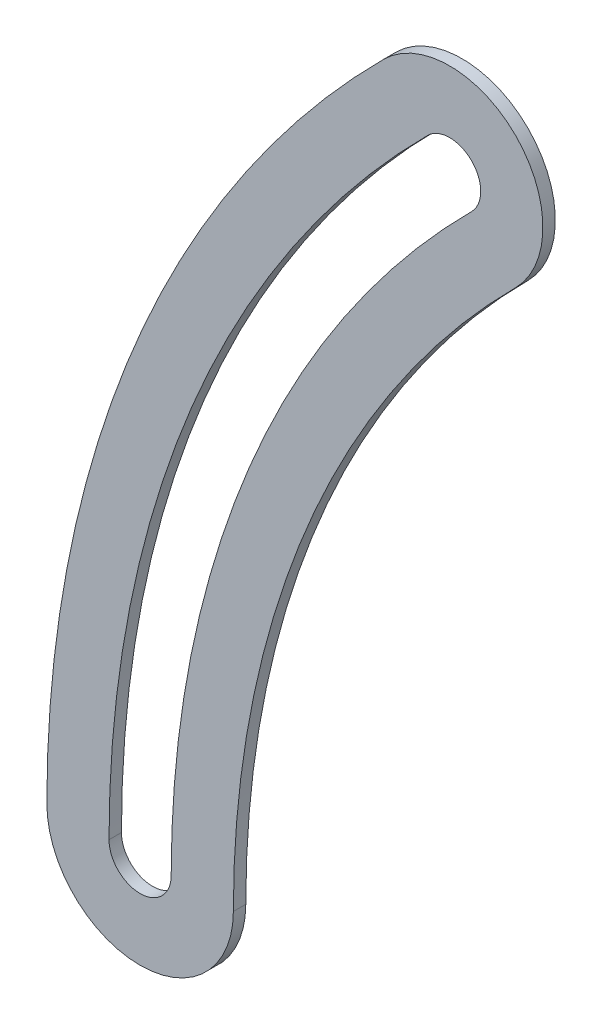
ISO-10303-21;
HEADER;
FILE_DESCRIPTION(('STEP AP214'),'2;1');
FILE_NAME('part.step','',(''),(''),'','','');
FILE_SCHEMA(('AUTOMOTIVE_DESIGN { 1 0 10303 214 1 1 1 1 }'));
ENDSEC;
DATA;
#1=APPLICATION_CONTEXT('core data for automotive mechanical design processes');
#2=APPLICATION_PROTOCOL_DEFINITION('international standard','automotive_design',2000,#1);
#3=PRODUCT_CONTEXT('',#1,'mechanical');
#4=PRODUCT('Part','Part','',(#3));
#5=PRODUCT_RELATED_PRODUCT_CATEGORY('part','',(#4));
#6=PRODUCT_DEFINITION_FORMATION('','',#4);
#7=PRODUCT_DEFINITION_CONTEXT('part definition',#1,'design');
#8=PRODUCT_DEFINITION('design','',#6,#7);
#9=PRODUCT_DEFINITION_SHAPE('','',#8);
#10=(LENGTH_UNIT() NAMED_UNIT(*) SI_UNIT(.MILLI.,.METRE.));
#11=(NAMED_UNIT(*) PLANE_ANGLE_UNIT() SI_UNIT($,.RADIAN.));
#12=(NAMED_UNIT(*) SI_UNIT($,.STERADIAN.) SOLID_ANGLE_UNIT());
#13=UNCERTAINTY_MEASURE_WITH_UNIT(LENGTH_MEASURE(1.E-05),#10,'distance_accuracy_value','');
#14=(GEOMETRIC_REPRESENTATION_CONTEXT(3) GLOBAL_UNCERTAINTY_ASSIGNED_CONTEXT((#13)) GLOBAL_UNIT_ASSIGNED_CONTEXT((#10,
#11,#12)) REPRESENTATION_CONTEXT('',''));
#15=CARTESIAN_POINT('',(0.,0.,0.));
#16=DIRECTION('',(0.,0.,1.));
#17=DIRECTION('',(1.,0.,0.));
#18=AXIS2_PLACEMENT_3D('',#15,#16,#17);
#19=CARTESIAN_POINT('',(-30.0520382004281,30.0520382004282,1.));
#20=DIRECTION('',(0.,0.,1.));
#21=DIRECTION('',(1.,0.,0.));
#22=AXIS2_PLACEMENT_3D('',#19,#20,#21);
#23=PLANE('',#22);
#24=CARTESIAN_POINT('',(-60.1040764008564,60.1040764008566,1.));
#25=DIRECTION('',(0.,0.,1.));
#26=DIRECTION('',(1.,0.,0.));
#27=AXIS2_PLACEMENT_3D('',#24,#25,#26);
#28=CIRCLE('',#27,7.49999999999999);
#29=CARTESIAN_POINT('',(-54.8007755419573,54.8007755419575,1.));
#30=VERTEX_POINT('',#29);
#31=CARTESIAN_POINT('',(-65.4073772597555,65.4073772597558,1.));
#32=VERTEX_POINT('',#31);
#33=EDGE_CURVE('E159',#30,#32,#28,.T.);
#34=ORIENTED_EDGE('',*,*,#33,.T.);
#35=CARTESIAN_POINT('',(1.73472347597681E-13,-1.73472347597681E-13,1.));
#36=DIRECTION('',(0.,0.,1.));
#37=DIRECTION('',(1.,0.,0.));
#38=AXIS2_PLACEMENT_3D('',#35,#36,#37);
#39=CIRCLE('',#38,92.5000000000003);
#40=CARTESIAN_POINT('',(-92.5000000000001,0.,1.));
#41=VERTEX_POINT('',#40);
#42=EDGE_CURVE('E163',#32,#41,#39,.T.);
#43=ORIENTED_EDGE('',*,*,#42,.T.);
#44=CARTESIAN_POINT('',(-85.,0.,1.));
#45=DIRECTION('',(0.,0.,1.));
#46=DIRECTION('',(1.,0.,0.));
#47=AXIS2_PLACEMENT_3D('',#44,#45,#46);
#48=CIRCLE('',#47,7.50000000000001);
#49=CARTESIAN_POINT('',(-77.5,0.,1.));
#50=VERTEX_POINT('',#49);
#51=EDGE_CURVE('E167',#41,#50,#48,.T.);
#52=ORIENTED_EDGE('',*,*,#51,.T.);
#53=CARTESIAN_POINT('',(1.73472347597681E-13,-1.73472347597681E-13,1.));
#54=DIRECTION('',(0.,0.,-1.));
#55=DIRECTION('',(1.,0.,0.));
#56=AXIS2_PLACEMENT_3D('',#53,#54,#55);
#57=CIRCLE('',#56,77.5000000000003);
#58=EDGE_CURVE('E170',#50,#30,#57,.T.);
#59=ORIENTED_EDGE('',*,*,#58,.T.);
#60=EDGE_LOOP('',(#34,#43,#52,#59));
#61=FACE_BOUND('',#60,.T.);
#62=CARTESIAN_POINT('',(2.84494650060196E-13,-2.84494650060196E-13,1.));
#63=DIRECTION('',(0.,0.,1.));
#64=DIRECTION('',(1.,0.,0.));
#65=AXIS2_PLACEMENT_3D('',#62,#63,#64);
#66=CIRCLE('',#65,87.5000000000003);
#67=CARTESIAN_POINT('',(-61.8718433538227,61.871843353823,1.));
#68=VERTEX_POINT('',#67);
#69=CARTESIAN_POINT('',(-87.5,-2.73778990567657E-13,1.));
#70=VERTEX_POINT('',#69);
#71=EDGE_CURVE('E120',#68,#70,#66,.T.);
#72=ORIENTED_EDGE('',*,*,#71,.F.);
#73=CARTESIAN_POINT('',(-60.1040764008564,60.1040764008566,1.));
#74=DIRECTION('',(0.,0.,1.));
#75=DIRECTION('',(1.,0.,0.));
#76=AXIS2_PLACEMENT_3D('',#73,#74,#75);
#77=CIRCLE('',#76,2.5);
#78=CARTESIAN_POINT('',(-58.33630944789,58.3363094478902,1.));
#79=VERTEX_POINT('',#78);
#80=EDGE_CURVE('E111',#79,#68,#77,.T.);
#81=ORIENTED_EDGE('',*,*,#80,.F.);
#82=CARTESIAN_POINT('',(2.84494650060196E-13,-2.84494650060196E-13,1.));
#83=DIRECTION('',(0.,0.,-1.));
#84=DIRECTION('',(1.,0.,0.));
#85=AXIS2_PLACEMENT_3D('',#82,#83,#84);
#86=CIRCLE('',#85,82.5000000000003);
#87=CARTESIAN_POINT('',(-82.5,-7.61057883380547E-13,1.));
#88=VERTEX_POINT('',#87);
#89=EDGE_CURVE('E137',#88,#79,#86,.T.);
#90=ORIENTED_EDGE('',*,*,#89,.F.);
#91=CARTESIAN_POINT('',(-85.,-7.61057883380547E-13,1.));
#92=DIRECTION('',(0.,0.,1.));
#93=DIRECTION('',(1.,0.,0.));
#94=AXIS2_PLACEMENT_3D('',#91,#92,#93);
#95=CIRCLE('',#94,2.5);
#96=EDGE_CURVE('E133',#70,#88,#95,.T.);
#97=ORIENTED_EDGE('',*,*,#96,.F.);
#98=EDGE_LOOP('',(#72,#81,#90,#97));
#99=FACE_BOUND('',#98,.T.);
#100=ADVANCED_FACE('F45',(#61,#99),#23,.T.);
#101=CARTESIAN_POINT('',(-30.0520382004281,30.0520382004282,0.));
#102=DIRECTION('',(0.,0.,1.));
#103=DIRECTION('',(1.,0.,0.));
#104=AXIS2_PLACEMENT_3D('',#101,#102,#103);
#105=PLANE('',#104);
#106=CARTESIAN_POINT('',(-60.1040764008564,60.1040764008566,0.));
#107=DIRECTION('',(0.,0.,1.));
#108=DIRECTION('',(1.,0.,0.));
#109=AXIS2_PLACEMENT_3D('',#106,#107,#108);
#110=CIRCLE('',#109,7.49999999999999);
#111=CARTESIAN_POINT('',(-54.8007755419573,54.8007755419575,0.));
#112=VERTEX_POINT('',#111);
#113=CARTESIAN_POINT('',(-65.4073772597555,65.4073772597558,0.));
#114=VERTEX_POINT('',#113);
#115=EDGE_CURVE('E129',#112,#114,#110,.T.);
#116=ORIENTED_EDGE('',*,*,#115,.F.);
#117=CARTESIAN_POINT('',(1.73472347597681E-13,-1.73472347597681E-13,0.));
#118=DIRECTION('',(0.,0.,-1.));
#119=DIRECTION('',(1.,0.,0.));
#120=AXIS2_PLACEMENT_3D('',#117,#118,#119);
#121=CIRCLE('',#120,77.5000000000003);
#122=CARTESIAN_POINT('',(-77.5,0.,0.));
#123=VERTEX_POINT('',#122);
#124=EDGE_CURVE('E164',#123,#112,#121,.T.);
#125=ORIENTED_EDGE('',*,*,#124,.F.);
#126=CARTESIAN_POINT('',(-85.,0.,0.));
#127=DIRECTION('',(0.,0.,1.));
#128=DIRECTION('',(1.,0.,0.));
#129=AXIS2_PLACEMENT_3D('',#126,#127,#128);
#130=CIRCLE('',#129,7.50000000000001);
#131=CARTESIAN_POINT('',(-92.5000000000001,0.,0.));
#132=VERTEX_POINT('',#131);
#133=EDGE_CURVE('E180',#132,#123,#130,.T.);
#134=ORIENTED_EDGE('',*,*,#133,.F.);
#135=CARTESIAN_POINT('',(1.73472347597681E-13,-1.73472347597681E-13,0.));
#136=DIRECTION('',(0.,0.,1.));
#137=DIRECTION('',(1.,0.,0.));
#138=AXIS2_PLACEMENT_3D('',#135,#136,#137);
#139=CIRCLE('',#138,92.5000000000003);
#140=EDGE_CURVE('E177',#114,#132,#139,.T.);
#141=ORIENTED_EDGE('',*,*,#140,.F.);
#142=EDGE_LOOP('',(#116,#125,#134,#141));
#143=FACE_BOUND('',#142,.T.);
#144=CARTESIAN_POINT('',(-60.1040764008564,60.1040764008566,0.));
#145=DIRECTION('',(0.,0.,1.));
#146=DIRECTION('',(1.,0.,0.));
#147=AXIS2_PLACEMENT_3D('',#144,#145,#146);
#148=CIRCLE('',#147,2.5);
#149=CARTESIAN_POINT('',(-58.33630944789,58.3363094478902,0.));
#150=VERTEX_POINT('',#149);
#151=CARTESIAN_POINT('',(-61.8718433538227,61.871843353823,0.));
#152=VERTEX_POINT('',#151);
#153=EDGE_CURVE('E69',#150,#152,#148,.T.);
#154=ORIENTED_EDGE('',*,*,#153,.T.);
#155=CARTESIAN_POINT('',(2.84494650060196E-13,-2.84494650060196E-13,0.));
#156=DIRECTION('',(0.,0.,1.));
#157=DIRECTION('',(1.,0.,0.));
#158=AXIS2_PLACEMENT_3D('',#155,#156,#157);
#159=CIRCLE('',#158,87.5000000000003);
#160=CARTESIAN_POINT('',(-87.5,-2.73778990567657E-13,0.));
#161=VERTEX_POINT('',#160);
#162=EDGE_CURVE('E127',#152,#161,#159,.T.);
#163=ORIENTED_EDGE('',*,*,#162,.T.);
#164=CARTESIAN_POINT('',(-85.,-7.61057883380547E-13,0.));
#165=DIRECTION('',(0.,0.,1.));
#166=DIRECTION('',(1.,0.,0.));
#167=AXIS2_PLACEMENT_3D('',#164,#165,#166);
#168=CIRCLE('',#167,2.5);
#169=CARTESIAN_POINT('',(-82.5,-7.61057883380547E-13,0.));
#170=VERTEX_POINT('',#169);
#171=EDGE_CURVE('E146',#161,#170,#168,.T.);
#172=ORIENTED_EDGE('',*,*,#171,.T.);
#173=CARTESIAN_POINT('',(2.84494650060196E-13,-2.84494650060196E-13,0.));
#174=DIRECTION('',(0.,0.,-1.));
#175=DIRECTION('',(1.,0.,0.));
#176=AXIS2_PLACEMENT_3D('',#173,#174,#175);
#177=CIRCLE('',#176,82.5000000000003);
#178=EDGE_CURVE('E121',#170,#150,#177,.T.);
#179=ORIENTED_EDGE('',*,*,#178,.T.);
#180=EDGE_LOOP('',(#154,#163,#172,#179));
#181=FACE_BOUND('',#180,.T.);
#182=ADVANCED_FACE('F203',(#143,#181),#105,.F.);
#183=CARTESIAN_POINT('',(-60.1040764008564,60.1040764008566,1.));
#184=DIRECTION('',(0.,0.,-1.));
#185=DIRECTION('',(-1.,0.,0.));
#186=AXIS2_PLACEMENT_3D('',#183,#184,#185);
#187=CYLINDRICAL_SURFACE('',#186,7.49999999999999);
#188=ORIENTED_EDGE('',*,*,#115,.T.);
#189=DIRECTION('',(0.,0.,-1.));
#190=VECTOR('',#189,1.);
#191=CARTESIAN_POINT('',(-65.4073772597555,65.4073772597558,1.));
#192=LINE('',#191,#190);
#193=EDGE_CURVE('E11',#32,#114,#192,.T.);
#194=ORIENTED_EDGE('',*,*,#193,.F.);
#195=ORIENTED_EDGE('',*,*,#33,.F.);
#196=DIRECTION('',(0.,0.,-1.));
#197=VECTOR('',#196,1.);
#198=CARTESIAN_POINT('',(-54.8007755419573,54.8007755419575,1.));
#199=LINE('',#198,#197);
#200=EDGE_CURVE('E173',#30,#112,#199,.T.);
#201=ORIENTED_EDGE('',*,*,#200,.T.);
#202=EDGE_LOOP('',(#188,#194,#195,#201));
#203=FACE_BOUND('',#202,.T.);
#204=ADVANCED_FACE('F47',(#203),#187,.T.);
#205=CARTESIAN_POINT('',(1.73472347597681E-13,-1.73472347597681E-13,1.));
#206=DIRECTION('',(0.,0.,-1.));
#207=DIRECTION('',(-1.,0.,0.));
#208=AXIS2_PLACEMENT_3D('',#205,#206,#207);
#209=CYLINDRICAL_SURFACE('',#208,92.5000000000003);
#210=ORIENTED_EDGE('',*,*,#140,.T.);
#211=DIRECTION('',(0.,0.,-1.));
#212=VECTOR('',#211,1.);
#213=CARTESIAN_POINT('',(-92.5000000000001,0.,1.));
#214=LINE('',#213,#212);
#215=EDGE_CURVE('E54',#41,#132,#214,.T.);
#216=ORIENTED_EDGE('',*,*,#215,.F.);
#217=ORIENTED_EDGE('',*,*,#42,.F.);
#218=ORIENTED_EDGE('',*,*,#193,.T.);
#219=EDGE_LOOP('',(#210,#216,#217,#218));
#220=FACE_BOUND('',#219,.T.);
#221=ADVANCED_FACE('F213',(#220),#209,.T.);
#222=CARTESIAN_POINT('',(-85.,0.,1.));
#223=DIRECTION('',(0.,0.,-1.));
#224=DIRECTION('',(-1.,0.,0.));
#225=AXIS2_PLACEMENT_3D('',#222,#223,#224);
#226=CYLINDRICAL_SURFACE('',#225,7.50000000000001);
#227=ORIENTED_EDGE('',*,*,#133,.T.);
#228=DIRECTION('',(0.,0.,-1.));
#229=VECTOR('',#228,1.);
#230=CARTESIAN_POINT('',(-77.5,0.,1.));
#231=LINE('',#230,#229);
#232=EDGE_CURVE('E188',#50,#123,#231,.T.);
#233=ORIENTED_EDGE('',*,*,#232,.F.);
#234=ORIENTED_EDGE('',*,*,#51,.F.);
#235=ORIENTED_EDGE('',*,*,#215,.T.);
#236=EDGE_LOOP('',(#227,#233,#234,#235));
#237=FACE_BOUND('',#236,.T.);
#238=ADVANCED_FACE('F197',(#237),#226,.T.);
#239=CARTESIAN_POINT('',(1.73472347597681E-13,-1.73472347597681E-13,1.));
#240=DIRECTION('',(0.,0.,-1.));
#241=DIRECTION('',(-1.,0.,0.));
#242=AXIS2_PLACEMENT_3D('',#239,#240,#241);
#243=CYLINDRICAL_SURFACE('',#242,77.5000000000003);
#244=ORIENTED_EDGE('',*,*,#124,.T.);
#245=ORIENTED_EDGE('',*,*,#200,.F.);
#246=ORIENTED_EDGE('',*,*,#58,.F.);
#247=ORIENTED_EDGE('',*,*,#232,.T.);
#248=EDGE_LOOP('',(#244,#245,#246,#247));
#249=FACE_BOUND('',#248,.T.);
#250=ADVANCED_FACE('F207',(#249),#243,.F.);
#251=CARTESIAN_POINT('',(-60.1040764008564,60.1040764008566,1.));
#252=DIRECTION('',(0.,0.,-1.));
#253=DIRECTION('',(-1.,0.,0.));
#254=AXIS2_PLACEMENT_3D('',#251,#252,#253);
#255=CYLINDRICAL_SURFACE('',#254,2.5);
#256=ORIENTED_EDGE('',*,*,#153,.F.);
#257=DIRECTION('',(0.,0.,-1.));
#258=VECTOR('',#257,1.);
#259=CARTESIAN_POINT('',(-58.33630944789,58.3363094478902,1.));
#260=LINE('',#259,#258);
#261=EDGE_CURVE('E115',#79,#150,#260,.T.);
#262=ORIENTED_EDGE('',*,*,#261,.F.);
#263=ORIENTED_EDGE('',*,*,#80,.T.);
#264=DIRECTION('',(0.,0.,-1.));
#265=VECTOR('',#264,1.);
#266=CARTESIAN_POINT('',(-61.8718433538227,61.871843353823,1.));
#267=LINE('',#266,#265);
#268=EDGE_CURVE('E114',#68,#152,#267,.T.);
#269=ORIENTED_EDGE('',*,*,#268,.T.);
#270=EDGE_LOOP('',(#256,#262,#263,#269));
#271=FACE_BOUND('',#270,.T.);
#272=ADVANCED_FACE('F113',(#271),#255,.F.);
#273=CARTESIAN_POINT('',(2.84494650060196E-13,-2.84494650060196E-13,1.));
#274=DIRECTION('',(0.,0.,-1.));
#275=DIRECTION('',(-1.,0.,0.));
#276=AXIS2_PLACEMENT_3D('',#273,#274,#275);
#277=CYLINDRICAL_SURFACE('',#276,87.5000000000003);
#278=ORIENTED_EDGE('',*,*,#162,.F.);
#279=ORIENTED_EDGE('',*,*,#268,.F.);
#280=ORIENTED_EDGE('',*,*,#71,.T.);
#281=DIRECTION('',(0.,0.,-1.));
#282=VECTOR('',#281,1.);
#283=CARTESIAN_POINT('',(-87.5,-2.73778990567657E-13,1.));
#284=LINE('',#283,#282);
#285=EDGE_CURVE('E130',#70,#161,#284,.T.);
#286=ORIENTED_EDGE('',*,*,#285,.T.);
#287=EDGE_LOOP('',(#278,#279,#280,#286));
#288=FACE_BOUND('',#287,.T.);
#289=ADVANCED_FACE('F124',(#288),#277,.F.);
#290=CARTESIAN_POINT('',(-85.,-7.61057883380547E-13,1.));
#291=DIRECTION('',(0.,0.,-1.));
#292=DIRECTION('',(-1.,0.,0.));
#293=AXIS2_PLACEMENT_3D('',#290,#291,#292);
#294=CYLINDRICAL_SURFACE('',#293,2.5);
#295=ORIENTED_EDGE('',*,*,#171,.F.);
#296=ORIENTED_EDGE('',*,*,#285,.F.);
#297=ORIENTED_EDGE('',*,*,#96,.T.);
#298=DIRECTION('',(0.,0.,-1.));
#299=VECTOR('',#298,1.);
#300=CARTESIAN_POINT('',(-82.5,-7.61057883380547E-13,1.));
#301=LINE('',#300,#299);
#302=EDGE_CURVE('E61',#88,#170,#301,.T.);
#303=ORIENTED_EDGE('',*,*,#302,.T.);
#304=EDGE_LOOP('',(#295,#296,#297,#303));
#305=FACE_BOUND('',#304,.T.);
#306=ADVANCED_FACE('F236',(#305),#294,.F.);
#307=CARTESIAN_POINT('',(2.84494650060196E-13,-2.84494650060196E-13,1.));
#308=DIRECTION('',(0.,0.,-1.));
#309=DIRECTION('',(-1.,0.,0.));
#310=AXIS2_PLACEMENT_3D('',#307,#308,#309);
#311=CYLINDRICAL_SURFACE('',#310,82.5000000000003);
#312=ORIENTED_EDGE('',*,*,#178,.F.);
#313=ORIENTED_EDGE('',*,*,#302,.F.);
#314=ORIENTED_EDGE('',*,*,#89,.T.);
#315=ORIENTED_EDGE('',*,*,#261,.T.);
#316=EDGE_LOOP('',(#312,#313,#314,#315));
#317=FACE_BOUND('',#316,.T.);
#318=ADVANCED_FACE('F240',(#317),#311,.T.);
#319=CLOSED_SHELL('',(#100,#182,#204,#221,#238,#250,#272,#289,#306,#318));
#320=MANIFOLD_SOLID_BREP('B2',#319);
#321=ADVANCED_BREP_SHAPE_REPRESENTATION('',(#18,#320),#14);
#322=SHAPE_DEFINITION_REPRESENTATION(#9,#321);
ENDSEC;
END-ISO-10303-21;
